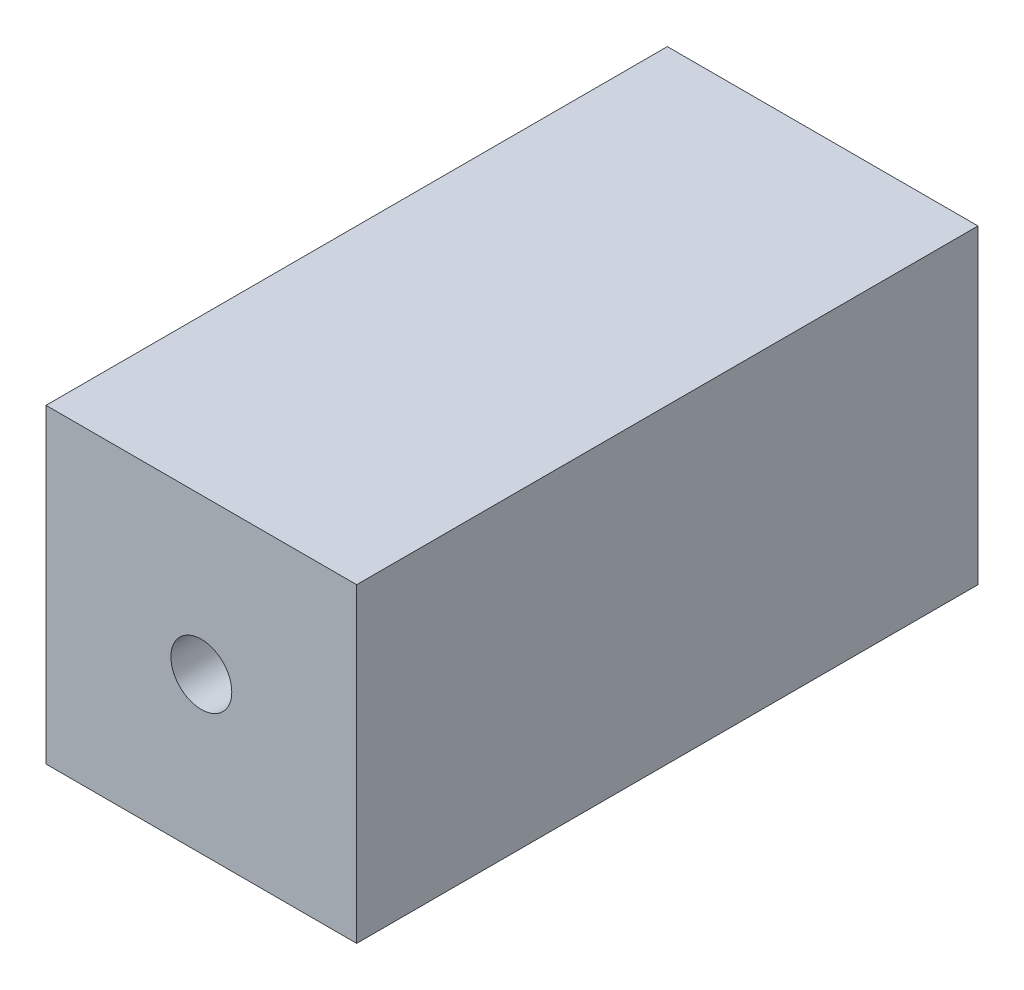
ISO-10303-21;
HEADER;
FILE_DESCRIPTION(('STEP AP214'),'2;1');
FILE_NAME('part.step','',(''),(''),'','','');
FILE_SCHEMA(('AUTOMOTIVE_DESIGN { 1 0 10303 214 1 1 1 1 }'));
ENDSEC;
DATA;
#1=APPLICATION_CONTEXT('core data for automotive mechanical design processes');
#2=APPLICATION_PROTOCOL_DEFINITION('international standard','automotive_design',2000,#1);
#3=PRODUCT_CONTEXT('',#1,'mechanical');
#4=PRODUCT('Part','Part','',(#3));
#5=PRODUCT_RELATED_PRODUCT_CATEGORY('part','',(#4));
#6=PRODUCT_DEFINITION_FORMATION('','',#4);
#7=PRODUCT_DEFINITION_CONTEXT('part definition',#1,'design');
#8=PRODUCT_DEFINITION('design','',#6,#7);
#9=PRODUCT_DEFINITION_SHAPE('','',#8);
#10=(LENGTH_UNIT() NAMED_UNIT(*) SI_UNIT(.MILLI.,.METRE.));
#11=(NAMED_UNIT(*) PLANE_ANGLE_UNIT() SI_UNIT($,.RADIAN.));
#12=(NAMED_UNIT(*) SI_UNIT($,.STERADIAN.) SOLID_ANGLE_UNIT());
#13=UNCERTAINTY_MEASURE_WITH_UNIT(LENGTH_MEASURE(1.E-05),#10,'distance_accuracy_value','');
#14=(GEOMETRIC_REPRESENTATION_CONTEXT(3) GLOBAL_UNCERTAINTY_ASSIGNED_CONTEXT((#13)) GLOBAL_UNIT_ASSIGNED_CONTEXT((#10,
#11,#12)) REPRESENTATION_CONTEXT('',''));
#15=CARTESIAN_POINT('',(0.,0.,0.));
#16=DIRECTION('',(0.,0.,1.));
#17=DIRECTION('',(1.,0.,0.));
#18=AXIS2_PLACEMENT_3D('',#15,#16,#17);
#19=CARTESIAN_POINT('',(0.,0.,50.8));
#20=DIRECTION('',(1.,0.,0.));
#21=DIRECTION('',(0.,0.,-1.));
#22=AXIS2_PLACEMENT_3D('',#19,#20,#21);
#23=PLANE('',#22);
#24=DIRECTION('',(0.,-1.,0.));
#25=VECTOR('',#24,1.);
#26=CARTESIAN_POINT('',(0.,0.,0.));
#27=LINE('',#26,#25);
#28=CARTESIAN_POINT('',(0.,25.4,0.));
#29=VERTEX_POINT('',#28);
#30=CARTESIAN_POINT('',(0.,0.,0.));
#31=VERTEX_POINT('',#30);
#32=EDGE_CURVE('E102',#29,#31,#27,.T.);
#33=ORIENTED_EDGE('',*,*,#32,.T.);
#34=DIRECTION('',(0.,0.,-1.));
#35=VECTOR('',#34,1.);
#36=CARTESIAN_POINT('',(0.,0.,50.8));
#37=LINE('',#36,#35);
#38=CARTESIAN_POINT('',(0.,0.,50.8));
#39=VERTEX_POINT('',#38);
#40=EDGE_CURVE('E11',#39,#31,#37,.T.);
#41=ORIENTED_EDGE('',*,*,#40,.F.);
#42=DIRECTION('',(0.,-1.,0.));
#43=VECTOR('',#42,1.);
#44=CARTESIAN_POINT('',(0.,0.,50.8));
#45=LINE('',#44,#43);
#46=CARTESIAN_POINT('',(0.,25.4,50.8));
#47=VERTEX_POINT('',#46);
#48=EDGE_CURVE('E90',#47,#39,#45,.T.);
#49=ORIENTED_EDGE('',*,*,#48,.F.);
#50=DIRECTION('',(0.,0.,-1.));
#51=VECTOR('',#50,1.);
#52=CARTESIAN_POINT('',(0.,25.4,50.8));
#53=LINE('',#52,#51);
#54=EDGE_CURVE('E98',#47,#29,#53,.T.);
#55=ORIENTED_EDGE('',*,*,#54,.T.);
#56=EDGE_LOOP('',(#33,#41,#49,#55));
#57=FACE_BOUND('',#56,.T.);
#58=ADVANCED_FACE('F39',(#57),#23,.F.);
#59=CARTESIAN_POINT('',(0.,0.,50.8));
#60=DIRECTION('',(0.,1.,0.));
#61=DIRECTION('',(0.,0.,1.));
#62=AXIS2_PLACEMENT_3D('',#59,#60,#61);
#63=PLANE('',#62);
#64=DIRECTION('',(1.,0.,0.));
#65=VECTOR('',#64,1.);
#66=CARTESIAN_POINT('',(0.,0.,0.));
#67=LINE('',#66,#65);
#68=CARTESIAN_POINT('',(25.4,0.,0.));
#69=VERTEX_POINT('',#68);
#70=EDGE_CURVE('E94',#31,#69,#67,.T.);
#71=ORIENTED_EDGE('',*,*,#70,.T.);
#72=DIRECTION('',(0.,0.,-1.));
#73=VECTOR('',#72,1.);
#74=CARTESIAN_POINT('',(25.4,0.,50.8));
#75=LINE('',#74,#73);
#76=CARTESIAN_POINT('',(25.4,0.,50.8));
#77=VERTEX_POINT('',#76);
#78=EDGE_CURVE('E47',#77,#69,#75,.T.);
#79=ORIENTED_EDGE('',*,*,#78,.F.);
#80=DIRECTION('',(1.,0.,0.));
#81=VECTOR('',#80,1.);
#82=CARTESIAN_POINT('',(0.,0.,50.8));
#83=LINE('',#82,#81);
#84=EDGE_CURVE('E85',#39,#77,#83,.T.);
#85=ORIENTED_EDGE('',*,*,#84,.F.);
#86=ORIENTED_EDGE('',*,*,#40,.T.);
#87=EDGE_LOOP('',(#71,#79,#85,#86));
#88=FACE_BOUND('',#87,.T.);
#89=ADVANCED_FACE('F93',(#88),#63,.F.);
#90=CARTESIAN_POINT('',(25.4,0.,50.8));
#91=DIRECTION('',(-1.,0.,0.));
#92=DIRECTION('',(0.,0.,1.));
#93=AXIS2_PLACEMENT_3D('',#90,#91,#92);
#94=PLANE('',#93);
#95=DIRECTION('',(0.,1.,0.));
#96=VECTOR('',#95,1.);
#97=CARTESIAN_POINT('',(25.4,0.,0.));
#98=LINE('',#97,#96);
#99=CARTESIAN_POINT('',(25.4,25.4,0.));
#100=VERTEX_POINT('',#99);
#101=EDGE_CURVE('E72',#69,#100,#98,.T.);
#102=ORIENTED_EDGE('',*,*,#101,.T.);
#103=DIRECTION('',(0.,0.,-1.));
#104=VECTOR('',#103,1.);
#105=CARTESIAN_POINT('',(25.4,25.4,50.8));
#106=LINE('',#105,#104);
#107=CARTESIAN_POINT('',(25.4,25.4,50.8));
#108=VERTEX_POINT('',#107);
#109=EDGE_CURVE('E95',#108,#100,#106,.T.);
#110=ORIENTED_EDGE('',*,*,#109,.F.);
#111=DIRECTION('',(0.,1.,0.));
#112=VECTOR('',#111,1.);
#113=CARTESIAN_POINT('',(25.4,0.,50.8));
#114=LINE('',#113,#112);
#115=EDGE_CURVE('E88',#77,#108,#114,.T.);
#116=ORIENTED_EDGE('',*,*,#115,.F.);
#117=ORIENTED_EDGE('',*,*,#78,.T.);
#118=EDGE_LOOP('',(#102,#110,#116,#117));
#119=FACE_BOUND('',#118,.T.);
#120=ADVANCED_FACE('F96',(#119),#94,.F.);
#121=CARTESIAN_POINT('',(0.,25.4,50.8));
#122=DIRECTION('',(0.,-1.,0.));
#123=DIRECTION('',(0.,0.,-1.));
#124=AXIS2_PLACEMENT_3D('',#121,#122,#123);
#125=PLANE('',#124);
#126=DIRECTION('',(-1.,0.,0.));
#127=VECTOR('',#126,1.);
#128=CARTESIAN_POINT('',(0.,25.4,0.));
#129=LINE('',#128,#127);
#130=EDGE_CURVE('E78',#100,#29,#129,.T.);
#131=ORIENTED_EDGE('',*,*,#130,.T.);
#132=ORIENTED_EDGE('',*,*,#54,.F.);
#133=DIRECTION('',(-1.,0.,0.));
#134=VECTOR('',#133,1.);
#135=CARTESIAN_POINT('',(0.,25.4,50.8));
#136=LINE('',#135,#134);
#137=EDGE_CURVE('E55',#108,#47,#136,.T.);
#138=ORIENTED_EDGE('',*,*,#137,.F.);
#139=ORIENTED_EDGE('',*,*,#109,.T.);
#140=EDGE_LOOP('',(#131,#132,#138,#139));
#141=FACE_BOUND('',#140,.T.);
#142=ADVANCED_FACE('F110',(#141),#125,.F.);
#143=CARTESIAN_POINT('',(0.,0.,50.8));
#144=DIRECTION('',(0.,0.,-1.));
#145=DIRECTION('',(-1.,0.,0.));
#146=AXIS2_PLACEMENT_3D('',#143,#144,#145);
#147=PLANE('',#146);
#148=CARTESIAN_POINT('',(12.7,12.7,50.8));
#149=DIRECTION('',(0.,0.,1.));
#150=DIRECTION('',(1.,0.,0.));
#151=AXIS2_PLACEMENT_3D('',#148,#149,#150);
#152=CIRCLE('',#151,2.4892);
#153=CARTESIAN_POINT('',(15.1892,12.7,50.8));
#154=VERTEX_POINT('',#153);
#155=EDGE_CURVE('E116',#154,#154,#152,.T.);
#156=ORIENTED_EDGE('',*,*,#155,.F.);
#157=EDGE_LOOP('',(#156));
#158=FACE_BOUND('',#157,.T.);
#159=ORIENTED_EDGE('',*,*,#48,.T.);
#160=ORIENTED_EDGE('',*,*,#84,.T.);
#161=ORIENTED_EDGE('',*,*,#115,.T.);
#162=ORIENTED_EDGE('',*,*,#137,.T.);
#163=EDGE_LOOP('',(#159,#160,#161,#162));
#164=FACE_BOUND('',#163,.T.);
#165=ADVANCED_FACE('F86',(#158,#164),#147,.F.);
#166=CARTESIAN_POINT('',(0.,0.,0.));
#167=DIRECTION('',(0.,0.,-1.));
#168=DIRECTION('',(-1.,0.,0.));
#169=AXIS2_PLACEMENT_3D('',#166,#167,#168);
#170=PLANE('',#169);
#171=CARTESIAN_POINT('',(12.7,12.7,0.));
#172=DIRECTION('',(0.,0.,1.));
#173=DIRECTION('',(1.,0.,0.));
#174=AXIS2_PLACEMENT_3D('',#171,#172,#173);
#175=CIRCLE('',#174,2.4892);
#176=CARTESIAN_POINT('',(15.1892,12.7,0.));
#177=VERTEX_POINT('',#176);
#178=EDGE_CURVE('E105',#177,#177,#175,.T.);
#179=ORIENTED_EDGE('',*,*,#178,.T.);
#180=EDGE_LOOP('',(#179));
#181=FACE_BOUND('',#180,.T.);
#182=ORIENTED_EDGE('',*,*,#32,.F.);
#183=ORIENTED_EDGE('',*,*,#130,.F.);
#184=ORIENTED_EDGE('',*,*,#101,.F.);
#185=ORIENTED_EDGE('',*,*,#70,.F.);
#186=EDGE_LOOP('',(#182,#183,#184,#185));
#187=FACE_BOUND('',#186,.T.);
#188=ADVANCED_FACE('F113',(#181,#187),#170,.T.);
#189=CARTESIAN_POINT('',(12.7,12.7,0.));
#190=DIRECTION('',(0.,0.,1.));
#191=DIRECTION('',(1.,0.,0.));
#192=AXIS2_PLACEMENT_3D('',#189,#190,#191);
#193=CYLINDRICAL_SURFACE('',#192,2.4892);
#194=ORIENTED_EDGE('',*,*,#178,.F.);
#195=EDGE_LOOP('',(#194));
#196=FACE_BOUND('',#195,.T.);
#197=ORIENTED_EDGE('',*,*,#155,.T.);
#198=EDGE_LOOP('',(#197));
#199=FACE_BOUND('',#198,.T.);
#200=ADVANCED_FACE('F123',(#196,#199),#193,.F.);
#201=CLOSED_SHELL('',(#58,#89,#120,#142,#165,#188,#200));
#202=MANIFOLD_SOLID_BREP('B2',#201);
#203=ADVANCED_BREP_SHAPE_REPRESENTATION('',(#18,#202),#14);
#204=SHAPE_DEFINITION_REPRESENTATION(#9,#203);
ENDSEC;
END-ISO-10303-21;
